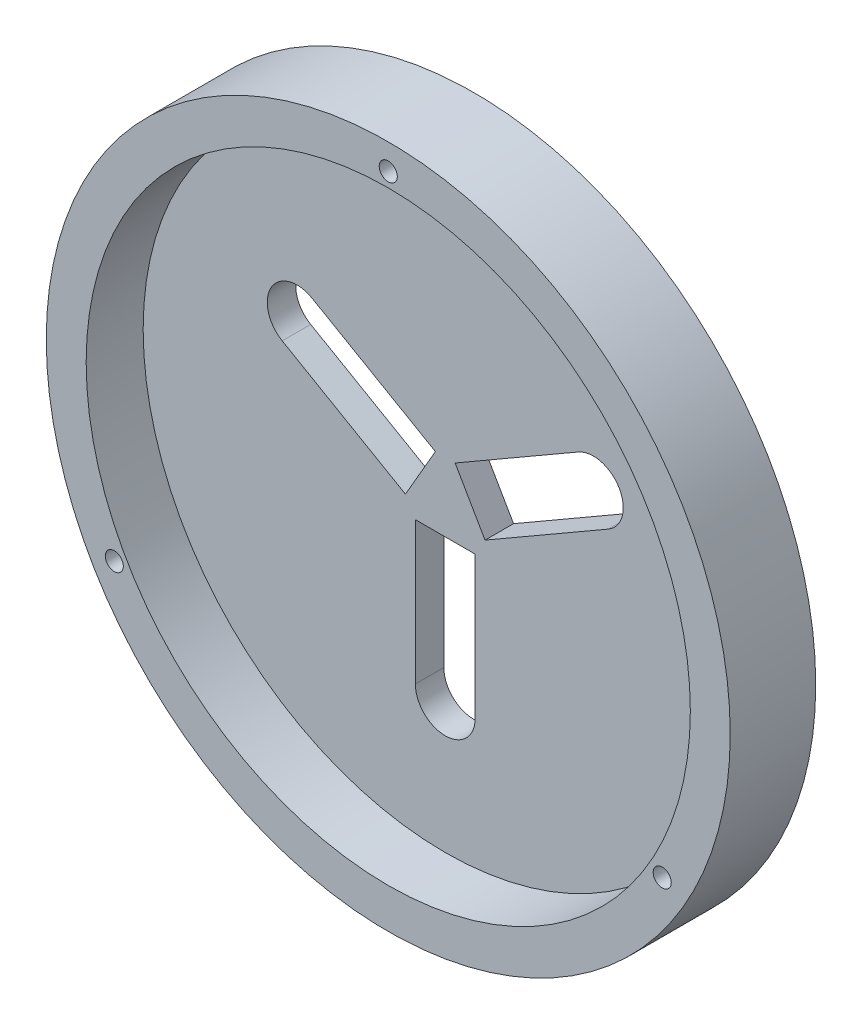
ISO-10303-21;
HEADER;
FILE_DESCRIPTION(('STEP AP214'),'2;1');
FILE_NAME('part.step','',(''),(''),'','','');
FILE_SCHEMA(('AUTOMOTIVE_DESIGN { 1 0 10303 214 1 1 1 1 }'));
ENDSEC;
DATA;
#1=APPLICATION_CONTEXT('core data for automotive mechanical design processes');
#2=APPLICATION_PROTOCOL_DEFINITION('international standard','automotive_design',2000,#1);
#3=PRODUCT_CONTEXT('',#1,'mechanical');
#4=PRODUCT('Part','Part','',(#3));
#5=PRODUCT_RELATED_PRODUCT_CATEGORY('part','',(#4));
#6=PRODUCT_DEFINITION_FORMATION('','',#4);
#7=PRODUCT_DEFINITION_CONTEXT('part definition',#1,'design');
#8=PRODUCT_DEFINITION('design','',#6,#7);
#9=PRODUCT_DEFINITION_SHAPE('','',#8);
#10=(LENGTH_UNIT() NAMED_UNIT(*) SI_UNIT(.MILLI.,.METRE.));
#11=(NAMED_UNIT(*) PLANE_ANGLE_UNIT() SI_UNIT($,.RADIAN.));
#12=(NAMED_UNIT(*) SI_UNIT($,.STERADIAN.) SOLID_ANGLE_UNIT());
#13=UNCERTAINTY_MEASURE_WITH_UNIT(LENGTH_MEASURE(1.E-05),#10,'distance_accuracy_value','');
#14=(GEOMETRIC_REPRESENTATION_CONTEXT(3) GLOBAL_UNCERTAINTY_ASSIGNED_CONTEXT((#13)) GLOBAL_UNIT_ASSIGNED_CONTEXT((#10,
#11,#12)) REPRESENTATION_CONTEXT('',''));
#15=CARTESIAN_POINT('',(0.,0.,0.));
#16=DIRECTION('',(0.,0.,1.));
#17=DIRECTION('',(1.,0.,0.));
#18=AXIS2_PLACEMENT_3D('',#15,#16,#17);
#19=CARTESIAN_POINT('',(-48.0644099100327,-27.7500000000021,0.));
#20=DIRECTION('',(0.,0.,1.));
#21=DIRECTION('',(1.,0.,0.));
#22=AXIS2_PLACEMENT_3D('',#19,#20,#21);
#23=CYLINDRICAL_SURFACE('',#22,1.5875);
#24=CARTESIAN_POINT('',(-48.0644099100327,-27.7500000000021,15.));
#25=DIRECTION('',(0.,0.,1.));
#26=DIRECTION('',(1.,0.,0.));
#27=AXIS2_PLACEMENT_3D('',#24,#25,#26);
#28=CIRCLE('',#27,1.5875);
#29=CARTESIAN_POINT('',(-46.4769099100327,-27.7500000000021,15.));
#30=VERTEX_POINT('',#29);
#31=EDGE_CURVE('E318',#30,#30,#28,.T.);
#32=ORIENTED_EDGE('',*,*,#31,.T.);
#33=EDGE_LOOP('',(#32));
#34=FACE_BOUND('',#33,.T.);
#35=CARTESIAN_POINT('',(-48.0644099100327,-27.7500000000021,3.));
#36=DIRECTION('',(0.,0.,-1.));
#37=DIRECTION('',(-1.,0.,0.));
#38=AXIS2_PLACEMENT_3D('',#35,#36,#37);
#39=CIRCLE('',#38,1.5875);
#40=CARTESIAN_POINT('',(-49.6519099100327,-27.7500000000021,3.));
#41=VERTEX_POINT('',#40);
#42=EDGE_CURVE('E116',#41,#41,#39,.F.);
#43=ORIENTED_EDGE('',*,*,#42,.F.);
#44=EDGE_LOOP('',(#43));
#45=FACE_BOUND('',#44,.T.);
#46=ADVANCED_FACE('F112',(#34,#45),#23,.F.);
#47=CARTESIAN_POINT('',(48.06440991004,-27.7499999999979,0.));
#48=DIRECTION('',(0.,0.,1.));
#49=DIRECTION('',(1.,0.,0.));
#50=AXIS2_PLACEMENT_3D('',#47,#48,#49);
#51=CYLINDRICAL_SURFACE('',#50,1.58750000000001);
#52=CARTESIAN_POINT('',(48.06440991004,-27.7499999999979,15.));
#53=DIRECTION('',(0.,0.,1.));
#54=DIRECTION('',(1.,0.,0.));
#55=AXIS2_PLACEMENT_3D('',#52,#53,#54);
#56=CIRCLE('',#55,1.58750000000001);
#57=CARTESIAN_POINT('',(49.65190991004,-27.7499999999979,15.));
#58=VERTEX_POINT('',#57);
#59=EDGE_CURVE('E232',#58,#58,#56,.T.);
#60=ORIENTED_EDGE('',*,*,#59,.T.);
#61=EDGE_LOOP('',(#60));
#62=FACE_BOUND('',#61,.T.);
#63=CARTESIAN_POINT('',(48.06440991004,-27.7499999999979,3.));
#64=DIRECTION('',(0.,0.,-1.));
#65=DIRECTION('',(-1.,0.,0.));
#66=AXIS2_PLACEMENT_3D('',#63,#64,#65);
#67=CIRCLE('',#66,1.58750000000001);
#68=CARTESIAN_POINT('',(46.47690991004,-27.7499999999979,3.));
#69=VERTEX_POINT('',#68);
#70=EDGE_CURVE('E312',#69,#69,#67,.F.);
#71=ORIENTED_EDGE('',*,*,#70,.F.);
#72=EDGE_LOOP('',(#71));
#73=FACE_BOUND('',#72,.T.);
#74=ADVANCED_FACE('F361',(#62,#73),#51,.F.);
#75=CARTESIAN_POINT('',(0.,55.5,0.));
#76=DIRECTION('',(0.,0.,1.));
#77=DIRECTION('',(1.,0.,0.));
#78=AXIS2_PLACEMENT_3D('',#75,#76,#77);
#79=CYLINDRICAL_SURFACE('',#78,1.5875);
#80=CARTESIAN_POINT('',(0.,55.5,15.));
#81=DIRECTION('',(0.,0.,1.));
#82=DIRECTION('',(1.,0.,0.));
#83=AXIS2_PLACEMENT_3D('',#80,#81,#82);
#84=CIRCLE('',#83,1.5875);
#85=CARTESIAN_POINT('',(1.5875,55.5,15.));
#86=VERTEX_POINT('',#85);
#87=EDGE_CURVE('E227',#86,#86,#84,.T.);
#88=ORIENTED_EDGE('',*,*,#87,.T.);
#89=EDGE_LOOP('',(#88));
#90=FACE_BOUND('',#89,.T.);
#91=CARTESIAN_POINT('',(0.,55.5,3.));
#92=DIRECTION('',(0.,0.,-1.));
#93=DIRECTION('',(-1.,0.,0.));
#94=AXIS2_PLACEMENT_3D('',#91,#92,#93);
#95=CIRCLE('',#94,1.5875);
#96=CARTESIAN_POINT('',(-1.5875,55.5,3.));
#97=VERTEX_POINT('',#96);
#98=EDGE_CURVE('E310',#97,#97,#95,.F.);
#99=ORIENTED_EDGE('',*,*,#98,.F.);
#100=EDGE_LOOP('',(#99));
#101=FACE_BOUND('',#100,.T.);
#102=ADVANCED_FACE('F367',(#90,#101),#79,.F.);
#103=CARTESIAN_POINT('',(0.,0.,5.));
#104=DIRECTION('',(0.,0.,1.));
#105=DIRECTION('',(1.,0.,0.));
#106=AXIS2_PLACEMENT_3D('',#103,#104,#105);
#107=PLANE('',#106);
#108=DIRECTION('',(0.,-1.,0.));
#109=VECTOR('',#108,1.);
#110=CARTESIAN_POINT('',(-5.25,0.,5.));
#111=LINE('',#110,#109);
#112=CARTESIAN_POINT('',(-5.25,-5.03108891324552,5.));
#113=VERTEX_POINT('',#112);
#114=CARTESIAN_POINT('',(-5.25,-30.,5.));
#115=VERTEX_POINT('',#114);
#116=EDGE_CURVE('E200',#113,#115,#111,.T.);
#117=ORIENTED_EDGE('',*,*,#116,.F.);
#118=DIRECTION('',(1.,0.,0.));
#119=VECTOR('',#118,1.);
#120=CARTESIAN_POINT('',(8.71410161513771,-5.03108891324552,5.));
#121=LINE('',#120,#119);
#122=CARTESIAN_POINT('',(5.25,-5.03108891324552,5.));
#123=VERTEX_POINT('',#122);
#124=EDGE_CURVE('E205',#113,#123,#121,.T.);
#125=ORIENTED_EDGE('',*,*,#124,.T.);
#126=DIRECTION('',(0.,-1.,0.));
#127=VECTOR('',#126,1.);
#128=CARTESIAN_POINT('',(5.25,0.,5.));
#129=LINE('',#128,#127);
#130=CARTESIAN_POINT('',(5.25,-30.,5.));
#131=VERTEX_POINT('',#130);
#132=EDGE_CURVE('E258',#123,#131,#129,.T.);
#133=ORIENTED_EDGE('',*,*,#132,.T.);
#134=CARTESIAN_POINT('',(0.,-30.,5.));
#135=DIRECTION('',(0.,0.,1.));
#136=DIRECTION('',(1.,0.,0.));
#137=AXIS2_PLACEMENT_3D('',#134,#135,#136);
#138=CIRCLE('',#137,5.25);
#139=EDGE_CURVE('E208',#115,#131,#138,.T.);
#140=ORIENTED_EDGE('',*,*,#139,.F.);
#141=EDGE_LOOP('',(#117,#125,#133,#140));
#142=FACE_BOUND('',#141,.T.);
#143=DIRECTION('',(-0.866025403784436,0.500000000000004,0.));
#144=VECTOR('',#143,1.);
#145=CARTESIAN_POINT('',(2.62500000000002,4.54663336986829,5.));
#146=LINE('',#145,#144);
#147=CARTESIAN_POINT('',(-1.73205080756883,7.06217782649107,5.));
#148=VERTEX_POINT('',#147);
#149=CARTESIAN_POINT('',(-23.3557621135331,19.5466333698684,5.));
#150=VERTEX_POINT('',#149);
#151=EDGE_CURVE('E264',#148,#150,#146,.T.);
#152=ORIENTED_EDGE('',*,*,#151,.F.);
#153=DIRECTION('',(-0.500000000000004,-0.866025403784436,0.));
#154=VECTOR('',#153,1.);
#155=CARTESIAN_POINT('',(-8.71410161513777,-5.03108891324552,5.));
#156=LINE('',#155,#154);
#157=CARTESIAN_POINT('',(-6.98205080756887,-2.03108891324551,5.));
#158=VERTEX_POINT('',#157);
#159=EDGE_CURVE('E229',#148,#158,#156,.T.);
#160=ORIENTED_EDGE('',*,*,#159,.T.);
#161=DIRECTION('',(-0.866025403784436,0.500000000000004,0.));
#162=VECTOR('',#161,1.);
#163=CARTESIAN_POINT('',(-2.62500000000002,-4.54663336986829,5.));
#164=LINE('',#163,#162);
#165=CARTESIAN_POINT('',(-28.6057621135331,10.4533666301318,5.));
#166=VERTEX_POINT('',#165);
#167=EDGE_CURVE('E129',#158,#166,#164,.T.);
#168=ORIENTED_EDGE('',*,*,#167,.T.);
#169=CARTESIAN_POINT('',(-25.9807621135331,15.0000000000001,5.));
#170=DIRECTION('',(0.,0.,1.));
#171=DIRECTION('',(1.,0.,0.));
#172=AXIS2_PLACEMENT_3D('',#169,#170,#171);
#173=CIRCLE('',#172,5.25);
#174=EDGE_CURVE('E260',#150,#166,#173,.T.);
#175=ORIENTED_EDGE('',*,*,#174,.F.);
#176=EDGE_LOOP('',(#152,#160,#168,#175));
#177=FACE_BOUND('',#176,.T.);
#178=DIRECTION('',(0.866025403784443,0.499999999999992,0.));
#179=VECTOR('',#178,1.);
#180=CARTESIAN_POINT('',(2.62499999999996,-4.54663336986833,5.));
#181=LINE('',#180,#179);
#182=CARTESIAN_POINT('',(6.98205080756889,-2.03108891324558,5.));
#183=VERTEX_POINT('',#182);
#184=CARTESIAN_POINT('',(28.6057621135333,10.4533666301314,5.));
#185=VERTEX_POINT('',#184);
#186=EDGE_CURVE('E277',#183,#185,#181,.T.);
#187=ORIENTED_EDGE('',*,*,#186,.F.);
#188=DIRECTION('',(-0.499999999999996,0.866025403784441,0.));
#189=VECTOR('',#188,1.);
#190=CARTESIAN_POINT('',(0.,10.0621778264911,5.));
#191=LINE('',#190,#189);
#192=CARTESIAN_POINT('',(1.73205080756893,7.06217782649105,5.));
#193=VERTEX_POINT('',#192);
#194=EDGE_CURVE('E226',#183,#193,#191,.T.);
#195=ORIENTED_EDGE('',*,*,#194,.T.);
#196=DIRECTION('',(0.866025403784443,0.499999999999992,0.));
#197=VECTOR('',#196,1.);
#198=CARTESIAN_POINT('',(-2.62499999999996,4.54663336986833,5.));
#199=LINE('',#198,#197);
#200=CARTESIAN_POINT('',(23.3557621135333,19.5466333698681,5.));
#201=VERTEX_POINT('',#200);
#202=EDGE_CURVE('E271',#193,#201,#199,.T.);
#203=ORIENTED_EDGE('',*,*,#202,.T.);
#204=CARTESIAN_POINT('',(25.9807621135333,14.9999999999998,5.));
#205=DIRECTION('',(0.,0.,1.));
#206=DIRECTION('',(1.,0.,0.));
#207=AXIS2_PLACEMENT_3D('',#204,#205,#206);
#208=CIRCLE('',#207,5.25);
#209=EDGE_CURVE('E273',#185,#201,#208,.T.);
#210=ORIENTED_EDGE('',*,*,#209,.F.);
#211=EDGE_LOOP('',(#187,#195,#203,#210));
#212=FACE_BOUND('',#211,.T.);
#213=CARTESIAN_POINT('',(0.,0.,5.));
#214=DIRECTION('',(0.,0.,1.));
#215=DIRECTION('',(1.,0.,0.));
#216=AXIS2_PLACEMENT_3D('',#213,#214,#215);
#217=CIRCLE('',#216,53.);
#218=CARTESIAN_POINT('',(53.,0.,5.));
#219=VERTEX_POINT('',#218);
#220=EDGE_CURVE('E255',#219,#219,#217,.T.);
#221=ORIENTED_EDGE('',*,*,#220,.T.);
#222=EDGE_LOOP('',(#221));
#223=FACE_BOUND('',#222,.T.);
#224=ADVANCED_FACE('F202',(#142,#177,#212,#223),#107,.T.);
#225=CARTESIAN_POINT('',(0.,0.,0.));
#226=DIRECTION('',(0.,0.,1.));
#227=DIRECTION('',(1.,0.,0.));
#228=AXIS2_PLACEMENT_3D('',#225,#226,#227);
#229=PLANE('',#228);
#230=CARTESIAN_POINT('',(0.,55.5,0.));
#231=DIRECTION('',(0.,0.,-1.));
#232=DIRECTION('',(-1.,0.,0.));
#233=AXIS2_PLACEMENT_3D('',#230,#231,#232);
#234=CIRCLE('',#233,3.);
#235=CARTESIAN_POINT('',(-3.,55.5,0.));
#236=VERTEX_POINT('',#235);
#237=EDGE_CURVE('E453',#236,#236,#234,.T.);
#238=ORIENTED_EDGE('',*,*,#237,.F.);
#239=EDGE_LOOP('',(#238));
#240=FACE_BOUND('',#239,.T.);
#241=CARTESIAN_POINT('',(-48.0644099100399,-27.749999999998,0.));
#242=DIRECTION('',(0.,0.,-1.));
#243=DIRECTION('',(-1.,0.,0.));
#244=AXIS2_PLACEMENT_3D('',#241,#242,#243);
#245=CIRCLE('',#244,3.00000000000305);
#246=CARTESIAN_POINT('',(-51.0644099100429,-27.749999999998,0.));
#247=VERTEX_POINT('',#246);
#248=EDGE_CURVE('E461',#247,#247,#245,.T.);
#249=ORIENTED_EDGE('',*,*,#248,.F.);
#250=EDGE_LOOP('',(#249));
#251=FACE_BOUND('',#250,.T.);
#252=CARTESIAN_POINT('',(48.0644099100328,-27.7500000000021,0.));
#253=DIRECTION('',(0.,0.,-1.));
#254=DIRECTION('',(-1.,0.,0.));
#255=AXIS2_PLACEMENT_3D('',#252,#253,#254);
#256=CIRCLE('',#255,3.0000000000045);
#257=CARTESIAN_POINT('',(45.0644099100283,-27.7500000000021,0.));
#258=VERTEX_POINT('',#257);
#259=EDGE_CURVE('E467',#258,#258,#256,.T.);
#260=ORIENTED_EDGE('',*,*,#259,.F.);
#261=EDGE_LOOP('',(#260));
#262=FACE_BOUND('',#261,.T.);
#263=DIRECTION('',(1.,0.,0.));
#264=VECTOR('',#263,1.);
#265=CARTESIAN_POINT('',(8.71410161513771,-5.03108891324552,0.));
#266=LINE('',#265,#264);
#267=CARTESIAN_POINT('',(-5.25,-5.03108891324552,0.));
#268=VERTEX_POINT('',#267);
#269=CARTESIAN_POINT('',(5.25,-5.03108891324552,0.));
#270=VERTEX_POINT('',#269);
#271=EDGE_CURVE('E240',#268,#270,#266,.T.);
#272=ORIENTED_EDGE('',*,*,#271,.F.);
#273=DIRECTION('',(0.,-1.,0.));
#274=VECTOR('',#273,1.);
#275=CARTESIAN_POINT('',(-5.25,0.,0.));
#276=LINE('',#275,#274);
#277=CARTESIAN_POINT('',(-5.25,-30.,0.));
#278=VERTEX_POINT('',#277);
#279=EDGE_CURVE('E217',#268,#278,#276,.T.);
#280=ORIENTED_EDGE('',*,*,#279,.T.);
#281=CARTESIAN_POINT('',(0.,-30.,0.));
#282=DIRECTION('',(0.,0.,1.));
#283=DIRECTION('',(1.,0.,0.));
#284=AXIS2_PLACEMENT_3D('',#281,#282,#283);
#285=CIRCLE('',#284,5.25);
#286=CARTESIAN_POINT('',(5.25,-30.,0.));
#287=VERTEX_POINT('',#286);
#288=EDGE_CURVE('E290',#278,#287,#285,.T.);
#289=ORIENTED_EDGE('',*,*,#288,.T.);
#290=DIRECTION('',(0.,-1.,0.));
#291=VECTOR('',#290,1.);
#292=CARTESIAN_POINT('',(5.25,0.,0.));
#293=LINE('',#292,#291);
#294=EDGE_CURVE('E293',#270,#287,#293,.T.);
#295=ORIENTED_EDGE('',*,*,#294,.F.);
#296=EDGE_LOOP('',(#272,#280,#289,#295));
#297=FACE_BOUND('',#296,.T.);
#298=DIRECTION('',(-0.500000000000004,-0.866025403784436,0.));
#299=VECTOR('',#298,1.);
#300=CARTESIAN_POINT('',(-8.71410161513777,-5.03108891324552,0.));
#301=LINE('',#300,#299);
#302=CARTESIAN_POINT('',(-1.73205080756883,7.06217782649107,0.));
#303=VERTEX_POINT('',#302);
#304=CARTESIAN_POINT('',(-6.98205080756888,-2.03108891324551,0.));
#305=VERTEX_POINT('',#304);
#306=EDGE_CURVE('E235',#303,#305,#301,.T.);
#307=ORIENTED_EDGE('',*,*,#306,.F.);
#308=DIRECTION('',(-0.866025403784436,0.500000000000004,0.));
#309=VECTOR('',#308,1.);
#310=CARTESIAN_POINT('',(2.62500000000002,4.54663336986829,0.));
#311=LINE('',#310,#309);
#312=CARTESIAN_POINT('',(-23.3557621135331,19.5466333698684,0.));
#313=VERTEX_POINT('',#312);
#314=EDGE_CURVE('E302',#303,#313,#311,.T.);
#315=ORIENTED_EDGE('',*,*,#314,.T.);
#316=CARTESIAN_POINT('',(-25.9807621135331,15.0000000000001,0.));
#317=DIRECTION('',(0.,0.,1.));
#318=DIRECTION('',(1.,0.,0.));
#319=AXIS2_PLACEMENT_3D('',#316,#317,#318);
#320=CIRCLE('',#319,5.25);
#321=CARTESIAN_POINT('',(-28.6057621135331,10.4533666301318,0.));
#322=VERTEX_POINT('',#321);
#323=EDGE_CURVE('E304',#313,#322,#320,.T.);
#324=ORIENTED_EDGE('',*,*,#323,.T.);
#325=DIRECTION('',(-0.866025403784436,0.500000000000004,0.));
#326=VECTOR('',#325,1.);
#327=CARTESIAN_POINT('',(-2.62500000000002,-4.54663336986829,0.));
#328=LINE('',#327,#326);
#329=EDGE_CURVE('E220',#305,#322,#328,.T.);
#330=ORIENTED_EDGE('',*,*,#329,.F.);
#331=EDGE_LOOP('',(#307,#315,#324,#330));
#332=FACE_BOUND('',#331,.T.);
#333=DIRECTION('',(-0.499999999999996,0.866025403784441,0.));
#334=VECTOR('',#333,1.);
#335=CARTESIAN_POINT('',(0.,10.0621778264911,0.));
#336=LINE('',#335,#334);
#337=CARTESIAN_POINT('',(6.98205080756889,-2.03108891324558,0.));
#338=VERTEX_POINT('',#337);
#339=CARTESIAN_POINT('',(1.73205080756893,7.06217782649105,0.));
#340=VERTEX_POINT('',#339);
#341=EDGE_CURVE('E328',#338,#340,#336,.T.);
#342=ORIENTED_EDGE('',*,*,#341,.F.);
#343=DIRECTION('',(0.866025403784443,0.499999999999992,0.));
#344=VECTOR('',#343,1.);
#345=CARTESIAN_POINT('',(2.62499999999996,-4.54663336986833,0.));
#346=LINE('',#345,#344);
#347=CARTESIAN_POINT('',(28.6057621135333,10.4533666301314,0.));
#348=VERTEX_POINT('',#347);
#349=EDGE_CURVE('E295',#338,#348,#346,.T.);
#350=ORIENTED_EDGE('',*,*,#349,.T.);
#351=CARTESIAN_POINT('',(25.9807621135333,14.9999999999998,0.));
#352=DIRECTION('',(0.,0.,1.));
#353=DIRECTION('',(1.,0.,0.));
#354=AXIS2_PLACEMENT_3D('',#351,#352,#353);
#355=CIRCLE('',#354,5.25);
#356=CARTESIAN_POINT('',(23.3557621135333,19.5466333698681,0.));
#357=VERTEX_POINT('',#356);
#358=EDGE_CURVE('E297',#348,#357,#355,.T.);
#359=ORIENTED_EDGE('',*,*,#358,.T.);
#360=DIRECTION('',(0.866025403784443,0.499999999999992,0.));
#361=VECTOR('',#360,1.);
#362=CARTESIAN_POINT('',(-2.62499999999996,4.54663336986833,0.));
#363=LINE('',#362,#361);
#364=EDGE_CURVE('E300',#340,#357,#363,.T.);
#365=ORIENTED_EDGE('',*,*,#364,.F.);
#366=EDGE_LOOP('',(#342,#350,#359,#365));
#367=FACE_BOUND('',#366,.T.);
#368=CARTESIAN_POINT('',(0.,0.,0.));
#369=DIRECTION('',(0.,0.,1.));
#370=DIRECTION('',(1.,0.,0.));
#371=AXIS2_PLACEMENT_3D('',#368,#369,#370);
#372=CIRCLE('',#371,60.);
#373=CARTESIAN_POINT('',(60.,0.,0.));
#374=VERTEX_POINT('',#373);
#375=EDGE_CURVE('E252',#374,#374,#372,.T.);
#376=ORIENTED_EDGE('',*,*,#375,.F.);
#377=EDGE_LOOP('',(#376));
#378=FACE_BOUND('',#377,.T.);
#379=ADVANCED_FACE('F114',(#240,#251,#262,#297,#332,#367,#378),#229,.F.);
#380=CARTESIAN_POINT('',(-2.62500000000002,-4.54663336986829,-5.));
#381=DIRECTION('',(0.500000000000004,0.866025403784436,0.));
#382=DIRECTION('',(-0.866025403784436,0.500000000000004,0.));
#383=AXIS2_PLACEMENT_3D('',#380,#381,#382);
#384=PLANE('',#383);
#385=DIRECTION('',(0.,0.,1.));
#386=VECTOR('',#385,1.);
#387=CARTESIAN_POINT('',(-6.98205080756887,-2.03108891324551,-5.));
#388=LINE('',#387,#386);
#389=EDGE_CURVE('E133',#305,#158,#388,.T.);
#390=ORIENTED_EDGE('',*,*,#389,.F.);
#391=ORIENTED_EDGE('',*,*,#329,.T.);
#392=DIRECTION('',(0.,0.,1.));
#393=VECTOR('',#392,1.);
#394=CARTESIAN_POINT('',(-28.6057621135331,10.4533666301318,-5.));
#395=LINE('',#394,#393);
#396=EDGE_CURVE('E269',#322,#166,#395,.T.);
#397=ORIENTED_EDGE('',*,*,#396,.T.);
#398=ORIENTED_EDGE('',*,*,#167,.F.);
#399=EDGE_LOOP('',(#390,#391,#397,#398));
#400=FACE_BOUND('',#399,.T.);
#401=ADVANCED_FACE('F349',(#400),#384,.T.);
#402=CARTESIAN_POINT('',(-25.9807621135331,15.0000000000001,-5.));
#403=DIRECTION('',(0.,0.,1.));
#404=DIRECTION('',(1.,0.,0.));
#405=AXIS2_PLACEMENT_3D('',#402,#403,#404);
#406=CYLINDRICAL_SURFACE('',#405,5.25);
#407=DIRECTION('',(0.,0.,1.));
#408=VECTOR('',#407,1.);
#409=CARTESIAN_POINT('',(-23.3557621135331,19.5466333698684,-5.));
#410=LINE('',#409,#408);
#411=EDGE_CURVE('E266',#313,#150,#410,.T.);
#412=ORIENTED_EDGE('',*,*,#411,.T.);
#413=ORIENTED_EDGE('',*,*,#174,.T.);
#414=ORIENTED_EDGE('',*,*,#396,.F.);
#415=ORIENTED_EDGE('',*,*,#323,.F.);
#416=EDGE_LOOP('',(#412,#413,#414,#415));
#417=FACE_BOUND('',#416,.T.);
#418=ADVANCED_FACE('F346',(#417),#406,.F.);
#419=CARTESIAN_POINT('',(2.62500000000002,4.54663336986829,-5.));
#420=DIRECTION('',(0.500000000000004,0.866025403784436,0.));
#421=DIRECTION('',(-0.866025403784436,0.500000000000004,0.));
#422=AXIS2_PLACEMENT_3D('',#419,#420,#421);
#423=PLANE('',#422);
#424=ORIENTED_EDGE('',*,*,#314,.F.);
#425=DIRECTION('',(0.,0.,1.));
#426=VECTOR('',#425,1.);
#427=CARTESIAN_POINT('',(-1.73205080756883,7.06217782649107,-5.));
#428=LINE('',#427,#426);
#429=EDGE_CURVE('E12',#303,#148,#428,.T.);
#430=ORIENTED_EDGE('',*,*,#429,.T.);
#431=ORIENTED_EDGE('',*,*,#151,.T.);
#432=ORIENTED_EDGE('',*,*,#411,.F.);
#433=EDGE_LOOP('',(#424,#430,#431,#432));
#434=FACE_BOUND('',#433,.T.);
#435=ADVANCED_FACE('F342',(#434),#423,.F.);
#436=CARTESIAN_POINT('',(-2.62499999999996,4.54663336986833,-5.));
#437=DIRECTION('',(0.499999999999992,-0.866025403784443,0.));
#438=DIRECTION('',(0.866025403784443,0.499999999999992,0.));
#439=AXIS2_PLACEMENT_3D('',#436,#437,#438);
#440=PLANE('',#439);
#441=DIRECTION('',(0.,0.,1.));
#442=VECTOR('',#441,1.);
#443=CARTESIAN_POINT('',(1.73205080756893,7.06217782649105,-5.));
#444=LINE('',#443,#442);
#445=EDGE_CURVE('E242',#340,#193,#444,.T.);
#446=ORIENTED_EDGE('',*,*,#445,.F.);
#447=ORIENTED_EDGE('',*,*,#364,.T.);
#448=DIRECTION('',(0.,0.,1.));
#449=VECTOR('',#448,1.);
#450=CARTESIAN_POINT('',(23.3557621135333,19.5466333698681,-5.));
#451=LINE('',#450,#449);
#452=EDGE_CURVE('E261',#357,#201,#451,.T.);
#453=ORIENTED_EDGE('',*,*,#452,.T.);
#454=ORIENTED_EDGE('',*,*,#202,.F.);
#455=EDGE_LOOP('',(#446,#447,#453,#454));
#456=FACE_BOUND('',#455,.T.);
#457=ADVANCED_FACE('F393',(#456),#440,.T.);
#458=CARTESIAN_POINT('',(25.9807621135333,14.9999999999998,-5.));
#459=DIRECTION('',(0.,0.,1.));
#460=DIRECTION('',(1.,0.,0.));
#461=AXIS2_PLACEMENT_3D('',#458,#459,#460);
#462=CYLINDRICAL_SURFACE('',#461,5.25);
#463=DIRECTION('',(0.,0.,1.));
#464=VECTOR('',#463,1.);
#465=CARTESIAN_POINT('',(28.6057621135333,10.4533666301314,-5.));
#466=LINE('',#465,#464);
#467=EDGE_CURVE('E279',#348,#185,#466,.T.);
#468=ORIENTED_EDGE('',*,*,#467,.T.);
#469=ORIENTED_EDGE('',*,*,#209,.T.);
#470=ORIENTED_EDGE('',*,*,#452,.F.);
#471=ORIENTED_EDGE('',*,*,#358,.F.);
#472=EDGE_LOOP('',(#468,#469,#470,#471));
#473=FACE_BOUND('',#472,.T.);
#474=ADVANCED_FACE('F397',(#473),#462,.F.);
#475=CARTESIAN_POINT('',(2.62499999999996,-4.54663336986833,-5.));
#476=DIRECTION('',(0.499999999999992,-0.866025403784443,0.));
#477=DIRECTION('',(0.866025403784443,0.499999999999992,0.));
#478=AXIS2_PLACEMENT_3D('',#475,#476,#477);
#479=PLANE('',#478);
#480=ORIENTED_EDGE('',*,*,#349,.F.);
#481=DIRECTION('',(0.,0.,1.));
#482=VECTOR('',#481,1.);
#483=CARTESIAN_POINT('',(6.98205080756889,-2.03108891324558,-5.));
#484=LINE('',#483,#482);
#485=EDGE_CURVE('E121',#338,#183,#484,.T.);
#486=ORIENTED_EDGE('',*,*,#485,.T.);
#487=ORIENTED_EDGE('',*,*,#186,.T.);
#488=ORIENTED_EDGE('',*,*,#467,.F.);
#489=EDGE_LOOP('',(#480,#486,#487,#488));
#490=FACE_BOUND('',#489,.T.);
#491=ADVANCED_FACE('F403',(#490),#479,.F.);
#492=CARTESIAN_POINT('',(5.25,0.,-5.));
#493=DIRECTION('',(-1.,0.,0.));
#494=DIRECTION('',(0.,0.,1.));
#495=AXIS2_PLACEMENT_3D('',#492,#493,#494);
#496=PLANE('',#495);
#497=DIRECTION('',(0.,0.,1.));
#498=VECTOR('',#497,1.);
#499=CARTESIAN_POINT('',(5.25,-5.03108891324552,-5.));
#500=LINE('',#499,#498);
#501=EDGE_CURVE('E224',#270,#123,#500,.T.);
#502=ORIENTED_EDGE('',*,*,#501,.F.);
#503=ORIENTED_EDGE('',*,*,#294,.T.);
#504=DIRECTION('',(0.,0.,1.));
#505=VECTOR('',#504,1.);
#506=CARTESIAN_POINT('',(5.25,-30.,-5.));
#507=LINE('',#506,#505);
#508=EDGE_CURVE('E274',#287,#131,#507,.T.);
#509=ORIENTED_EDGE('',*,*,#508,.T.);
#510=ORIENTED_EDGE('',*,*,#132,.F.);
#511=EDGE_LOOP('',(#502,#503,#509,#510));
#512=FACE_BOUND('',#511,.T.);
#513=ADVANCED_FACE('F412',(#512),#496,.T.);
#514=CARTESIAN_POINT('',(0.,-30.,-5.));
#515=DIRECTION('',(0.,0.,1.));
#516=DIRECTION('',(1.,0.,0.));
#517=AXIS2_PLACEMENT_3D('',#514,#515,#516);
#518=CYLINDRICAL_SURFACE('',#517,5.25);
#519=DIRECTION('',(0.,0.,1.));
#520=VECTOR('',#519,1.);
#521=CARTESIAN_POINT('',(-5.25,-30.,-5.));
#522=LINE('',#521,#520);
#523=EDGE_CURVE('E212',#278,#115,#522,.T.);
#524=ORIENTED_EDGE('',*,*,#523,.T.);
#525=ORIENTED_EDGE('',*,*,#139,.T.);
#526=ORIENTED_EDGE('',*,*,#508,.F.);
#527=ORIENTED_EDGE('',*,*,#288,.F.);
#528=EDGE_LOOP('',(#524,#525,#526,#527));
#529=FACE_BOUND('',#528,.T.);
#530=ADVANCED_FACE('F409',(#529),#518,.F.);
#531=CARTESIAN_POINT('',(-5.25,0.,-5.));
#532=DIRECTION('',(-1.,0.,0.));
#533=DIRECTION('',(0.,-1.,0.));
#534=AXIS2_PLACEMENT_3D('',#531,#532,#533);
#535=PLANE('',#534);
#536=ORIENTED_EDGE('',*,*,#279,.F.);
#537=DIRECTION('',(0.,0.,1.));
#538=VECTOR('',#537,1.);
#539=CARTESIAN_POINT('',(-5.25,-5.03108891324552,-5.));
#540=LINE('',#539,#538);
#541=EDGE_CURVE('E215',#268,#113,#540,.T.);
#542=ORIENTED_EDGE('',*,*,#541,.T.);
#543=ORIENTED_EDGE('',*,*,#116,.T.);
#544=ORIENTED_EDGE('',*,*,#523,.F.);
#545=EDGE_LOOP('',(#536,#542,#543,#544));
#546=FACE_BOUND('',#545,.T.);
#547=ADVANCED_FACE('F216',(#546),#535,.F.);
#548=CARTESIAN_POINT('',(0.,0.,0.));
#549=DIRECTION('',(0.,0.,1.));
#550=DIRECTION('',(1.,0.,0.));
#551=AXIS2_PLACEMENT_3D('',#548,#549,#550);
#552=CYLINDRICAL_SURFACE('',#551,53.);
#553=ORIENTED_EDGE('',*,*,#220,.F.);
#554=EDGE_LOOP('',(#553));
#555=FACE_BOUND('',#554,.T.);
#556=CARTESIAN_POINT('',(0.,0.,15.));
#557=DIRECTION('',(0.,0.,1.));
#558=DIRECTION('',(1.,0.,0.));
#559=AXIS2_PLACEMENT_3D('',#556,#557,#558);
#560=CIRCLE('',#559,53.);
#561=CARTESIAN_POINT('',(53.,0.,15.));
#562=VERTEX_POINT('',#561);
#563=EDGE_CURVE('E246',#562,#562,#560,.T.);
#564=ORIENTED_EDGE('',*,*,#563,.T.);
#565=EDGE_LOOP('',(#564));
#566=FACE_BOUND('',#565,.T.);
#567=ADVANCED_FACE('F387',(#555,#566),#552,.F.);
#568=CARTESIAN_POINT('',(0.,0.,0.));
#569=DIRECTION('',(0.,0.,1.));
#570=DIRECTION('',(1.,0.,0.));
#571=AXIS2_PLACEMENT_3D('',#568,#569,#570);
#572=CYLINDRICAL_SURFACE('',#571,60.);
#573=ORIENTED_EDGE('',*,*,#375,.T.);
#574=EDGE_LOOP('',(#573));
#575=FACE_BOUND('',#574,.T.);
#576=CARTESIAN_POINT('',(0.,0.,15.));
#577=DIRECTION('',(0.,0.,1.));
#578=DIRECTION('',(1.,0.,0.));
#579=AXIS2_PLACEMENT_3D('',#576,#577,#578);
#580=CIRCLE('',#579,60.);
#581=CARTESIAN_POINT('',(60.,0.,15.));
#582=VERTEX_POINT('',#581);
#583=EDGE_CURVE('E249',#582,#582,#580,.T.);
#584=ORIENTED_EDGE('',*,*,#583,.F.);
#585=EDGE_LOOP('',(#584));
#586=FACE_BOUND('',#585,.T.);
#587=ADVANCED_FACE('F383',(#575,#586),#572,.T.);
#588=CARTESIAN_POINT('',(0.,0.,15.));
#589=DIRECTION('',(0.,0.,1.));
#590=DIRECTION('',(1.,0.,0.));
#591=AXIS2_PLACEMENT_3D('',#588,#589,#590);
#592=PLANE('',#591);
#593=ORIENTED_EDGE('',*,*,#87,.F.);
#594=EDGE_LOOP('',(#593));
#595=FACE_BOUND('',#594,.T.);
#596=ORIENTED_EDGE('',*,*,#59,.F.);
#597=EDGE_LOOP('',(#596));
#598=FACE_BOUND('',#597,.T.);
#599=ORIENTED_EDGE('',*,*,#31,.F.);
#600=EDGE_LOOP('',(#599));
#601=FACE_BOUND('',#600,.T.);
#602=ORIENTED_EDGE('',*,*,#563,.F.);
#603=EDGE_LOOP('',(#602));
#604=FACE_BOUND('',#603,.T.);
#605=ORIENTED_EDGE('',*,*,#583,.T.);
#606=EDGE_LOOP('',(#605));
#607=FACE_BOUND('',#606,.T.);
#608=ADVANCED_FACE('F376',(#595,#598,#601,#604,#607),#592,.T.);
#609=CARTESIAN_POINT('',(-8.71410161513777,-5.03108891324552,0.));
#610=DIRECTION('',(-0.866025403784436,0.500000000000004,0.));
#611=DIRECTION('',(-0.500000000000004,-0.866025403784436,0.));
#612=AXIS2_PLACEMENT_3D('',#609,#610,#611);
#613=PLANE('',#612);
#614=ORIENTED_EDGE('',*,*,#306,.T.);
#615=ORIENTED_EDGE('',*,*,#389,.T.);
#616=ORIENTED_EDGE('',*,*,#159,.F.);
#617=ORIENTED_EDGE('',*,*,#429,.F.);
#618=EDGE_LOOP('',(#614,#615,#616,#617));
#619=FACE_BOUND('',#618,.T.);
#620=ADVANCED_FACE('F335',(#619),#613,.T.);
#621=CARTESIAN_POINT('',(0.,10.0621778264911,0.));
#622=DIRECTION('',(0.866025403784441,0.499999999999996,0.));
#623=DIRECTION('',(-0.499999999999996,0.866025403784441,0.));
#624=AXIS2_PLACEMENT_3D('',#621,#622,#623);
#625=PLANE('',#624);
#626=ORIENTED_EDGE('',*,*,#341,.T.);
#627=ORIENTED_EDGE('',*,*,#445,.T.);
#628=ORIENTED_EDGE('',*,*,#194,.F.);
#629=ORIENTED_EDGE('',*,*,#485,.F.);
#630=EDGE_LOOP('',(#626,#627,#628,#629));
#631=FACE_BOUND('',#630,.T.);
#632=ADVANCED_FACE('F375',(#631),#625,.T.);
#633=CARTESIAN_POINT('',(8.71410161513771,-5.03108891324552,0.));
#634=DIRECTION('',(0.,-1.,0.));
#635=DIRECTION('',(1.,0.,0.));
#636=AXIS2_PLACEMENT_3D('',#633,#634,#635);
#637=PLANE('',#636);
#638=ORIENTED_EDGE('',*,*,#271,.T.);
#639=ORIENTED_EDGE('',*,*,#501,.T.);
#640=ORIENTED_EDGE('',*,*,#124,.F.);
#641=ORIENTED_EDGE('',*,*,#541,.F.);
#642=EDGE_LOOP('',(#638,#639,#640,#641));
#643=FACE_BOUND('',#642,.T.);
#644=ADVANCED_FACE('F222',(#643),#637,.T.);
#645=CARTESIAN_POINT('',(0.,55.5,3.));
#646=DIRECTION('',(0.,0.,-1.));
#647=DIRECTION('',(-1.,0.,0.));
#648=AXIS2_PLACEMENT_3D('',#645,#646,#647);
#649=PLANE('',#648);
#650=CARTESIAN_POINT('',(0.,55.5,3.));
#651=DIRECTION('',(0.,0.,-1.));
#652=DIRECTION('',(-1.,0.,0.));
#653=AXIS2_PLACEMENT_3D('',#650,#651,#652);
#654=CIRCLE('',#653,3.);
#655=CARTESIAN_POINT('',(-3.,55.5,3.));
#656=VERTEX_POINT('',#655);
#657=EDGE_CURVE('E313',#656,#656,#654,.T.);
#658=ORIENTED_EDGE('',*,*,#657,.T.);
#659=EDGE_LOOP('',(#658));
#660=FACE_BOUND('',#659,.T.);
#661=ORIENTED_EDGE('',*,*,#98,.T.);
#662=EDGE_LOOP('',(#661));
#663=FACE_BOUND('',#662,.T.);
#664=ADVANCED_FACE('F380',(#660,#663),#649,.T.);
#665=CARTESIAN_POINT('',(0.,55.5,3.));
#666=DIRECTION('',(0.,0.,-1.));
#667=DIRECTION('',(-1.,0.,0.));
#668=AXIS2_PLACEMENT_3D('',#665,#666,#667);
#669=CYLINDRICAL_SURFACE('',#668,3.);
#670=ORIENTED_EDGE('',*,*,#657,.F.);
#671=EDGE_LOOP('',(#670));
#672=FACE_BOUND('',#671,.T.);
#673=ORIENTED_EDGE('',*,*,#237,.T.);
#674=EDGE_LOOP('',(#673));
#675=FACE_BOUND('',#674,.T.);
#676=ADVANCED_FACE('F434',(#672,#675),#669,.F.);
#677=CARTESIAN_POINT('',(48.0644099100328,-27.7500000000021,3.));
#678=DIRECTION('',(0.,0.,-1.));
#679=DIRECTION('',(-1.,0.,0.));
#680=AXIS2_PLACEMENT_3D('',#677,#678,#679);
#681=PLANE('',#680);
#682=CARTESIAN_POINT('',(48.0644099100328,-27.7500000000021,3.));
#683=DIRECTION('',(0.,0.,-1.));
#684=DIRECTION('',(-1.,0.,0.));
#685=AXIS2_PLACEMENT_3D('',#682,#683,#684);
#686=CIRCLE('',#685,3.0000000000045);
#687=CARTESIAN_POINT('',(45.0644099100283,-27.7500000000021,3.));
#688=VERTEX_POINT('',#687);
#689=EDGE_CURVE('E464',#688,#688,#686,.T.);
#690=ORIENTED_EDGE('',*,*,#689,.T.);
#691=EDGE_LOOP('',(#690));
#692=FACE_BOUND('',#691,.T.);
#693=ORIENTED_EDGE('',*,*,#70,.T.);
#694=EDGE_LOOP('',(#693));
#695=FACE_BOUND('',#694,.T.);
#696=ADVANCED_FACE('F430',(#692,#695),#681,.T.);
#697=CARTESIAN_POINT('',(48.0644099100328,-27.7500000000021,3.));
#698=DIRECTION('',(0.,0.,-1.));
#699=DIRECTION('',(-1.,0.,0.));
#700=AXIS2_PLACEMENT_3D('',#697,#698,#699);
#701=CYLINDRICAL_SURFACE('',#700,3.0000000000045);
#702=ORIENTED_EDGE('',*,*,#689,.F.);
#703=EDGE_LOOP('',(#702));
#704=FACE_BOUND('',#703,.T.);
#705=ORIENTED_EDGE('',*,*,#259,.T.);
#706=EDGE_LOOP('',(#705));
#707=FACE_BOUND('',#706,.T.);
#708=ADVANCED_FACE('F426',(#704,#707),#701,.F.);
#709=CARTESIAN_POINT('',(-48.0644099100399,-27.749999999998,3.));
#710=DIRECTION('',(0.,0.,-1.));
#711=DIRECTION('',(-1.,0.,0.));
#712=AXIS2_PLACEMENT_3D('',#709,#710,#711);
#713=PLANE('',#712);
#714=CARTESIAN_POINT('',(-48.0644099100399,-27.749999999998,3.));
#715=DIRECTION('',(0.,0.,-1.));
#716=DIRECTION('',(-1.,0.,0.));
#717=AXIS2_PLACEMENT_3D('',#714,#715,#716);
#718=CIRCLE('',#717,3.00000000000305);
#719=CARTESIAN_POINT('',(-51.0644099100429,-27.749999999998,3.));
#720=VERTEX_POINT('',#719);
#721=EDGE_CURVE('E456',#720,#720,#718,.T.);
#722=ORIENTED_EDGE('',*,*,#721,.T.);
#723=EDGE_LOOP('',(#722));
#724=FACE_BOUND('',#723,.T.);
#725=ORIENTED_EDGE('',*,*,#42,.T.);
#726=EDGE_LOOP('',(#725));
#727=FACE_BOUND('',#726,.T.);
#728=ADVANCED_FACE('F429',(#724,#727),#713,.T.);
#729=CARTESIAN_POINT('',(-48.0644099100399,-27.749999999998,3.));
#730=DIRECTION('',(0.,0.,-1.));
#731=DIRECTION('',(-1.,0.,0.));
#732=AXIS2_PLACEMENT_3D('',#729,#730,#731);
#733=CYLINDRICAL_SURFACE('',#732,3.00000000000305);
#734=ORIENTED_EDGE('',*,*,#721,.F.);
#735=EDGE_LOOP('',(#734));
#736=FACE_BOUND('',#735,.T.);
#737=ORIENTED_EDGE('',*,*,#248,.T.);
#738=EDGE_LOOP('',(#737));
#739=FACE_BOUND('',#738,.T.);
#740=ADVANCED_FACE('F436',(#736,#739),#733,.F.);
#741=CLOSED_SHELL('',(#46,#74,#102,#224,#379,#401,#418,#435,#457,#474,#491,#513,#530,#547,#567,
#587,#608,#620,#632,#644,#664,#676,#696,#708,#728,#740));
#742=MANIFOLD_SOLID_BREP('B2',#741);
#743=ADVANCED_BREP_SHAPE_REPRESENTATION('',(#18,#742),#14);
#744=SHAPE_DEFINITION_REPRESENTATION(#9,#743);
ENDSEC;
END-ISO-10303-21;
